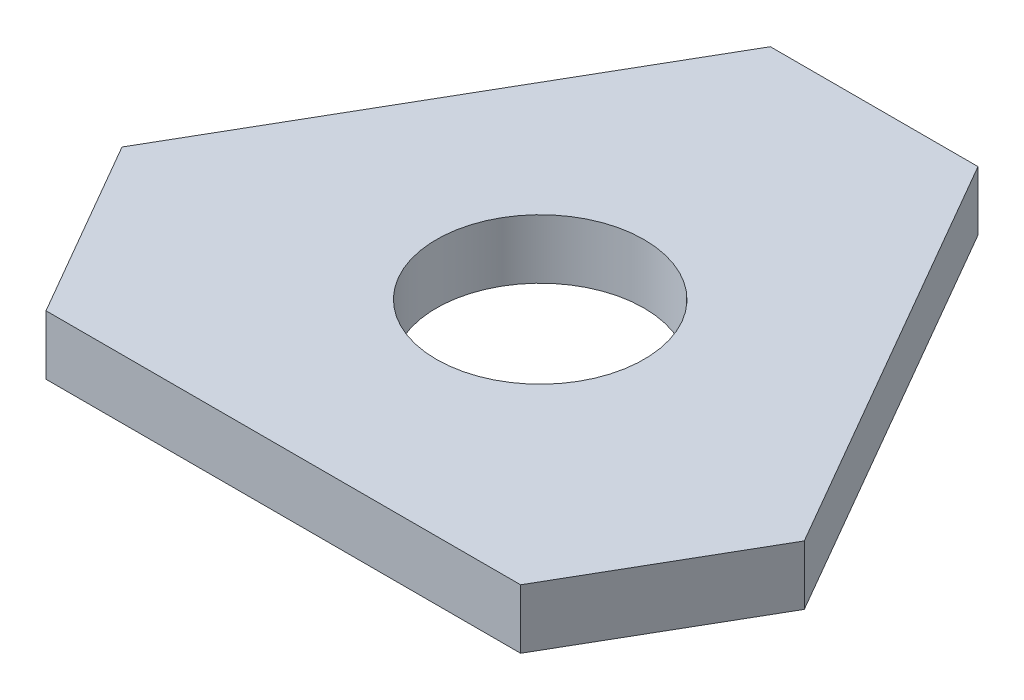
ISO-10303-21;
HEADER;
FILE_DESCRIPTION(('STEP AP214'),'2;1');
FILE_NAME('part.step','',(''),(''),'','','');
FILE_SCHEMA(('AUTOMOTIVE_DESIGN { 1 0 10303 214 1 1 1 1 }'));
ENDSEC;
DATA;
#1=APPLICATION_CONTEXT('core data for automotive mechanical design processes');
#2=APPLICATION_PROTOCOL_DEFINITION('international standard','automotive_design',2000,#1);
#3=PRODUCT_CONTEXT('',#1,'mechanical');
#4=PRODUCT('Part','Part','',(#3));
#5=PRODUCT_RELATED_PRODUCT_CATEGORY('part','',(#4));
#6=PRODUCT_DEFINITION_FORMATION('','',#4);
#7=PRODUCT_DEFINITION_CONTEXT('part definition',#1,'design');
#8=PRODUCT_DEFINITION('design','',#6,#7);
#9=PRODUCT_DEFINITION_SHAPE('','',#8);
#10=(LENGTH_UNIT() NAMED_UNIT(*) SI_UNIT(.MILLI.,.METRE.));
#11=(NAMED_UNIT(*) PLANE_ANGLE_UNIT() SI_UNIT($,.RADIAN.));
#12=(NAMED_UNIT(*) SI_UNIT($,.STERADIAN.) SOLID_ANGLE_UNIT());
#13=UNCERTAINTY_MEASURE_WITH_UNIT(LENGTH_MEASURE(1.E-05),#10,'distance_accuracy_value','');
#14=(GEOMETRIC_REPRESENTATION_CONTEXT(3) GLOBAL_UNCERTAINTY_ASSIGNED_CONTEXT((#13)) GLOBAL_UNIT_ASSIGNED_CONTEXT((#10,
#11,#12)) REPRESENTATION_CONTEXT('',''));
#15=CARTESIAN_POINT('',(0.,0.,0.));
#16=DIRECTION('',(0.,0.,1.));
#17=DIRECTION('',(1.,0.,0.));
#18=AXIS2_PLACEMENT_3D('',#15,#16,#17);
#19=CARTESIAN_POINT('',(0.,10.,0.));
#20=DIRECTION('',(0.,1.,0.));
#21=DIRECTION('',(0.,0.,1.));
#22=AXIS2_PLACEMENT_3D('',#19,#20,#21);
#23=PLANE('',#22);
#24=DIRECTION('',(-0.5,0.,-0.866025403784439));
#25=VECTOR('',#24,1.);
#26=CARTESIAN_POINT('',(144.96289889807,10.,3.1288780115058));
#27=LINE('',#26,#25);
#28=CARTESIAN_POINT('',(127.46289889807,10.,-27.1820111209496));
#29=VERTEX_POINT('',#28);
#30=CARTESIAN_POINT('',(87.4628988980701,10.,-96.4640434237046));
#31=VERTEX_POINT('',#30);
#32=EDGE_CURVE('E127',#29,#31,#27,.T.);
#33=ORIENTED_EDGE('',*,*,#32,.T.);
#34=DIRECTION('',(1.,0.,0.));
#35=VECTOR('',#34,1.);
#36=CARTESIAN_POINT('',(0.,10.,-96.4640434237046));
#37=LINE('',#36,#35);
#38=CARTESIAN_POINT('',(52.4628988980701,10.,-96.4640434237046));
#39=VERTEX_POINT('',#38);
#40=EDGE_CURVE('E141',#31,#39,#37,.F.);
#41=ORIENTED_EDGE('',*,*,#40,.T.);
#42=DIRECTION('',(-0.5,0.,0.866025403784439));
#43=VECTOR('',#42,1.);
#44=CARTESIAN_POINT('',(69.9628988980701,10.,-126.77493255616));
#45=LINE('',#44,#43);
#46=CARTESIAN_POINT('',(12.4628988980701,10.,-27.1820111209496));
#47=VERTEX_POINT('',#46);
#48=EDGE_CURVE('E112',#39,#47,#45,.T.);
#49=ORIENTED_EDGE('',*,*,#48,.T.);
#50=DIRECTION('',(-0.499999999999998,0.,-0.86602540378444));
#51=VECTOR('',#50,1.);
#52=CARTESIAN_POINT('',(21.1173302518993,10.,-12.1920963055003));
#53=LINE('',#52,#51);
#54=CARTESIAN_POINT('',(29.9628988980701,10.,3.1288780115058));
#55=VERTEX_POINT('',#54);
#56=EDGE_CURVE('E61',#47,#55,#53,.F.);
#57=ORIENTED_EDGE('',*,*,#56,.T.);
#58=DIRECTION('',(1.,0.,0.));
#59=VECTOR('',#58,1.);
#60=CARTESIAN_POINT('',(-5.03710110192993,10.,3.1288780115058));
#61=LINE('',#60,#59);
#62=CARTESIAN_POINT('',(109.96289889807,10.,3.1288780115058));
#63=VERTEX_POINT('',#62);
#64=EDGE_CURVE('E146',#55,#63,#61,.T.);
#65=ORIENTED_EDGE('',*,*,#64,.T.);
#66=DIRECTION('',(-0.5,0.,0.866025403784439));
#67=VECTOR('',#66,1.);
#68=CARTESIAN_POINT('',(83.8270180952058,10.,48.3975514626307));
#69=LINE('',#68,#67);
#70=EDGE_CURVE('E142',#63,#29,#69,.F.);
#71=ORIENTED_EDGE('',*,*,#70,.T.);
#72=EDGE_LOOP('',(#33,#41,#49,#57,#65,#71));
#73=FACE_BOUND('',#72,.T.);
#74=CARTESIAN_POINT('',(69.9628988980701,10.,-40.1723921777161));
#75=DIRECTION('',(0.,1.,0.));
#76=DIRECTION('',(0.,0.,1.));
#77=AXIS2_PLACEMENT_3D('',#74,#75,#76);
#78=CIRCLE('',#77,17.5);
#79=CARTESIAN_POINT('',(69.9628988980701,10.,-22.6723921777161));
#80=VERTEX_POINT('',#79);
#81=EDGE_CURVE('E125',#80,#80,#78,.T.);
#82=ORIENTED_EDGE('',*,*,#81,.F.);
#83=EDGE_LOOP('',(#82));
#84=FACE_BOUND('',#83,.T.);
#85=ADVANCED_FACE('F41',(#73,#84),#23,.T.);
#86=CARTESIAN_POINT('',(0.,0.,0.));
#87=DIRECTION('',(0.,1.,0.));
#88=DIRECTION('',(0.,0.,1.));
#89=AXIS2_PLACEMENT_3D('',#86,#87,#88);
#90=PLANE('',#89);
#91=DIRECTION('',(-0.5,0.,0.866025403784439));
#92=VECTOR('',#91,1.);
#93=CARTESIAN_POINT('',(69.9628988980701,0.,-126.77493255616));
#94=LINE('',#93,#92);
#95=CARTESIAN_POINT('',(52.4628988980701,0.,-96.4640434237046));
#96=VERTEX_POINT('',#95);
#97=CARTESIAN_POINT('',(12.4628988980701,0.,-27.1820111209496));
#98=VERTEX_POINT('',#97);
#99=EDGE_CURVE('E115',#96,#98,#94,.T.);
#100=ORIENTED_EDGE('',*,*,#99,.F.);
#101=DIRECTION('',(-1.,0.,0.));
#102=VECTOR('',#101,1.);
#103=CARTESIAN_POINT('',(52.4628988980701,0.,-96.4640434237046));
#104=LINE('',#103,#102);
#105=CARTESIAN_POINT('',(87.4628988980701,0.,-96.4640434237046));
#106=VERTEX_POINT('',#105);
#107=EDGE_CURVE('E94',#96,#106,#104,.F.);
#108=ORIENTED_EDGE('',*,*,#107,.T.);
#109=DIRECTION('',(-0.5,0.,-0.866025403784439));
#110=VECTOR('',#109,1.);
#111=CARTESIAN_POINT('',(144.96289889807,0.,3.1288780115058));
#112=LINE('',#111,#110);
#113=CARTESIAN_POINT('',(127.46289889807,0.,-27.1820111209496));
#114=VERTEX_POINT('',#113);
#115=EDGE_CURVE('E121',#114,#106,#112,.T.);
#116=ORIENTED_EDGE('',*,*,#115,.F.);
#117=DIRECTION('',(0.5,0.,-0.866025403784439));
#118=VECTOR('',#117,1.);
#119=CARTESIAN_POINT('',(127.46289889807,0.,-27.1820111209496));
#120=LINE('',#119,#118);
#121=CARTESIAN_POINT('',(109.96289889807,0.,3.1288780115058));
#122=VERTEX_POINT('',#121);
#123=EDGE_CURVE('E106',#114,#122,#120,.F.);
#124=ORIENTED_EDGE('',*,*,#123,.T.);
#125=DIRECTION('',(1.,0.,0.));
#126=VECTOR('',#125,1.);
#127=CARTESIAN_POINT('',(-5.03710110192993,0.,3.1288780115058));
#128=LINE('',#127,#126);
#129=CARTESIAN_POINT('',(29.9628988980701,0.,3.1288780115058));
#130=VERTEX_POINT('',#129);
#131=EDGE_CURVE('E122',#130,#122,#128,.T.);
#132=ORIENTED_EDGE('',*,*,#131,.F.);
#133=DIRECTION('',(0.499999999999998,0.,0.86602540378444));
#134=VECTOR('',#133,1.);
#135=CARTESIAN_POINT('',(29.9628988980701,0.,3.1288780115058));
#136=LINE('',#135,#134);
#137=EDGE_CURVE('E114',#130,#98,#136,.F.);
#138=ORIENTED_EDGE('',*,*,#137,.T.);
#139=EDGE_LOOP('',(#100,#108,#116,#124,#132,#138));
#140=FACE_BOUND('',#139,.T.);
#141=CARTESIAN_POINT('',(69.9628988980701,0.,-40.1723921777161));
#142=DIRECTION('',(0.,1.,0.));
#143=DIRECTION('',(0.,0.,1.));
#144=AXIS2_PLACEMENT_3D('',#141,#142,#143);
#145=CIRCLE('',#144,17.5);
#146=CARTESIAN_POINT('',(69.9628988980701,0.,-22.6723921777161));
#147=VERTEX_POINT('',#146);
#148=EDGE_CURVE('E126',#147,#147,#145,.T.);
#149=ORIENTED_EDGE('',*,*,#148,.T.);
#150=EDGE_LOOP('',(#149));
#151=FACE_BOUND('',#150,.T.);
#152=ADVANCED_FACE('F117',(#140,#151),#90,.F.);
#153=CARTESIAN_POINT('',(69.9628988980701,10.,-126.77493255616));
#154=DIRECTION('',(0.866025403784439,0.,0.5));
#155=DIRECTION('',(0.5,0.,-0.866025403784439));
#156=AXIS2_PLACEMENT_3D('',#153,#154,#155);
#157=PLANE('',#156);
#158=ORIENTED_EDGE('',*,*,#48,.F.);
#159=DIRECTION('',(0.,-1.,0.));
#160=VECTOR('',#159,1.);
#161=CARTESIAN_POINT('',(52.4628988980701,10.,-96.4640434237046));
#162=LINE('',#161,#160);
#163=EDGE_CURVE('E100',#39,#96,#162,.T.);
#164=ORIENTED_EDGE('',*,*,#163,.T.);
#165=ORIENTED_EDGE('',*,*,#99,.T.);
#166=DIRECTION('',(0.,1.,0.));
#167=VECTOR('',#166,1.);
#168=CARTESIAN_POINT('',(12.4628988980701,10.,-27.1820111209496));
#169=LINE('',#168,#167);
#170=EDGE_CURVE('E116',#98,#47,#169,.T.);
#171=ORIENTED_EDGE('',*,*,#170,.T.);
#172=EDGE_LOOP('',(#158,#164,#165,#171));
#173=FACE_BOUND('',#172,.T.);
#174=ADVANCED_FACE('F111',(#173),#157,.F.);
#175=CARTESIAN_POINT('',(-5.03710110192993,10.,3.1288780115058));
#176=DIRECTION('',(0.,0.,-1.));
#177=DIRECTION('',(-1.,0.,0.));
#178=AXIS2_PLACEMENT_3D('',#175,#176,#177);
#179=PLANE('',#178);
#180=ORIENTED_EDGE('',*,*,#131,.T.);
#181=DIRECTION('',(0.,1.,0.));
#182=VECTOR('',#181,1.);
#183=CARTESIAN_POINT('',(109.96289889807,10.,3.1288780115058));
#184=LINE('',#183,#182);
#185=EDGE_CURVE('E11',#122,#63,#184,.T.);
#186=ORIENTED_EDGE('',*,*,#185,.T.);
#187=ORIENTED_EDGE('',*,*,#64,.F.);
#188=DIRECTION('',(0.,-1.,0.));
#189=VECTOR('',#188,1.);
#190=CARTESIAN_POINT('',(29.9628988980701,10.,3.1288780115058));
#191=LINE('',#190,#189);
#192=EDGE_CURVE('E49',#55,#130,#191,.T.);
#193=ORIENTED_EDGE('',*,*,#192,.T.);
#194=EDGE_LOOP('',(#180,#186,#187,#193));
#195=FACE_BOUND('',#194,.T.);
#196=ADVANCED_FACE('F149',(#195),#179,.F.);
#197=CARTESIAN_POINT('',(144.96289889807,10.,3.1288780115058));
#198=DIRECTION('',(-0.866025403784439,0.,0.5));
#199=DIRECTION('',(0.5,0.,0.866025403784439));
#200=AXIS2_PLACEMENT_3D('',#197,#198,#199);
#201=PLANE('',#200);
#202=ORIENTED_EDGE('',*,*,#115,.T.);
#203=DIRECTION('',(0.,1.,0.));
#204=VECTOR('',#203,1.);
#205=CARTESIAN_POINT('',(87.4628988980701,10.,-96.4640434237046));
#206=LINE('',#205,#204);
#207=EDGE_CURVE('E99',#106,#31,#206,.T.);
#208=ORIENTED_EDGE('',*,*,#207,.T.);
#209=ORIENTED_EDGE('',*,*,#32,.F.);
#210=DIRECTION('',(0.,-1.,0.));
#211=VECTOR('',#210,1.);
#212=CARTESIAN_POINT('',(127.46289889807,10.,-27.1820111209496));
#213=LINE('',#212,#211);
#214=EDGE_CURVE('E102',#29,#114,#213,.T.);
#215=ORIENTED_EDGE('',*,*,#214,.T.);
#216=EDGE_LOOP('',(#202,#208,#209,#215));
#217=FACE_BOUND('',#216,.T.);
#218=ADVANCED_FACE('F154',(#217),#201,.F.);
#219=CARTESIAN_POINT('',(69.9628988980701,10.,-40.1723921777161));
#220=DIRECTION('',(0.,-1.,0.));
#221=DIRECTION('',(0.,0.,-1.));
#222=AXIS2_PLACEMENT_3D('',#219,#220,#221);
#223=CYLINDRICAL_SURFACE('',#222,17.5);
#224=ORIENTED_EDGE('',*,*,#81,.T.);
#225=EDGE_LOOP('',(#224));
#226=FACE_BOUND('',#225,.T.);
#227=ORIENTED_EDGE('',*,*,#148,.F.);
#228=EDGE_LOOP('',(#227));
#229=FACE_BOUND('',#228,.T.);
#230=ADVANCED_FACE('F162',(#226,#229),#223,.F.);
#231=CARTESIAN_POINT('',(52.4628988980701,10.,-96.4640434237046));
#232=DIRECTION('',(0.,0.,1.));
#233=DIRECTION('',(0.,-1.,0.));
#234=AXIS2_PLACEMENT_3D('',#231,#232,#233);
#235=PLANE('',#234);
#236=ORIENTED_EDGE('',*,*,#40,.F.);
#237=ORIENTED_EDGE('',*,*,#207,.F.);
#238=ORIENTED_EDGE('',*,*,#107,.F.);
#239=ORIENTED_EDGE('',*,*,#163,.F.);
#240=EDGE_LOOP('',(#236,#237,#238,#239));
#241=FACE_BOUND('',#240,.T.);
#242=ADVANCED_FACE('F96',(#241),#235,.F.);
#243=CARTESIAN_POINT('',(127.46289889807,10.,-27.1820111209496));
#244=DIRECTION('',(-0.866025403784439,0.,-0.5));
#245=DIRECTION('',(0.,-1.,0.));
#246=AXIS2_PLACEMENT_3D('',#243,#244,#245);
#247=PLANE('',#246);
#248=ORIENTED_EDGE('',*,*,#70,.F.);
#249=ORIENTED_EDGE('',*,*,#185,.F.);
#250=ORIENTED_EDGE('',*,*,#123,.F.);
#251=ORIENTED_EDGE('',*,*,#214,.F.);
#252=EDGE_LOOP('',(#248,#249,#250,#251));
#253=FACE_BOUND('',#252,.T.);
#254=ADVANCED_FACE('F155',(#253),#247,.F.);
#255=CARTESIAN_POINT('',(29.9628988980701,10.,3.1288780115058));
#256=DIRECTION('',(0.86602540378444,0.,-0.499999999999998));
#257=DIRECTION('',(0.,-1.,0.));
#258=AXIS2_PLACEMENT_3D('',#255,#256,#257);
#259=PLANE('',#258);
#260=ORIENTED_EDGE('',*,*,#56,.F.);
#261=ORIENTED_EDGE('',*,*,#170,.F.);
#262=ORIENTED_EDGE('',*,*,#137,.F.);
#263=ORIENTED_EDGE('',*,*,#192,.F.);
#264=EDGE_LOOP('',(#260,#261,#262,#263));
#265=FACE_BOUND('',#264,.T.);
#266=ADVANCED_FACE('F42',(#265),#259,.F.);
#267=CLOSED_SHELL('',(#85,#152,#174,#196,#218,#230,#242,#254,#266));
#268=MANIFOLD_SOLID_BREP('B2',#267);
#269=ADVANCED_BREP_SHAPE_REPRESENTATION('',(#18,#268),#14);
#270=SHAPE_DEFINITION_REPRESENTATION(#9,#269);
ENDSEC;
END-ISO-10303-21;
